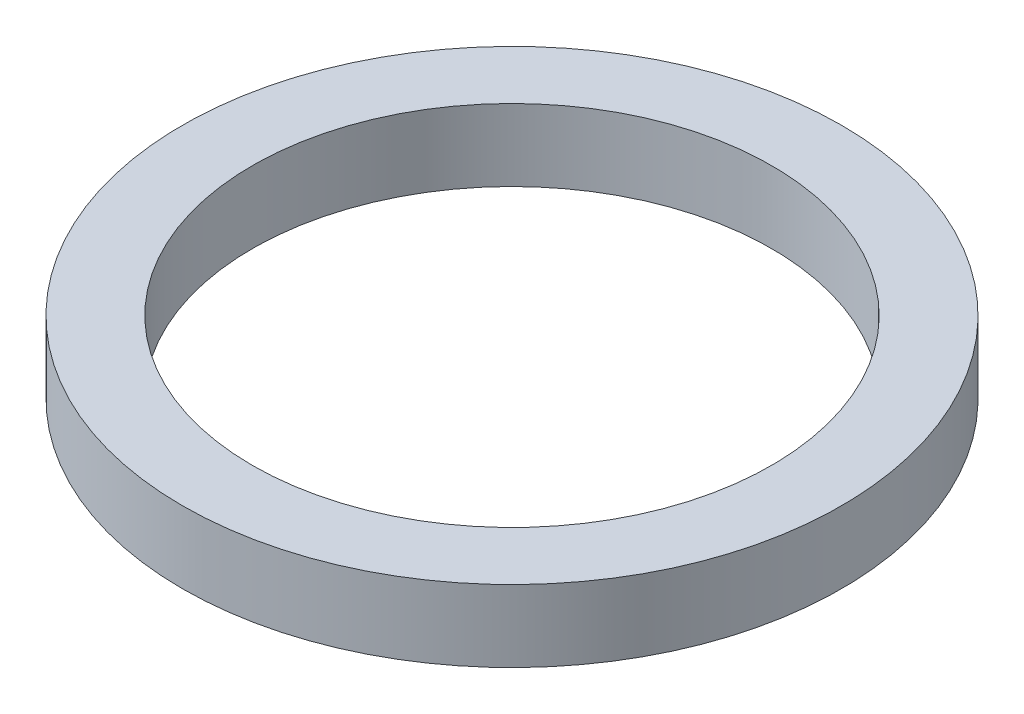
ISO-10303-21;
HEADER;
FILE_DESCRIPTION(('STEP AP214'),'2;1');
FILE_NAME('part.step','',(''),(''),'','','');
FILE_SCHEMA(('AUTOMOTIVE_DESIGN { 1 0 10303 214 1 1 1 1 }'));
ENDSEC;
DATA;
#1=APPLICATION_CONTEXT('core data for automotive mechanical design processes');
#2=APPLICATION_PROTOCOL_DEFINITION('international standard','automotive_design',2000,#1);
#3=PRODUCT_CONTEXT('',#1,'mechanical');
#4=PRODUCT('Part','Part','',(#3));
#5=PRODUCT_RELATED_PRODUCT_CATEGORY('part','',(#4));
#6=PRODUCT_DEFINITION_FORMATION('','',#4);
#7=PRODUCT_DEFINITION_CONTEXT('part definition',#1,'design');
#8=PRODUCT_DEFINITION('design','',#6,#7);
#9=PRODUCT_DEFINITION_SHAPE('','',#8);
#10=(LENGTH_UNIT() NAMED_UNIT(*) SI_UNIT(.MILLI.,.METRE.));
#11=(NAMED_UNIT(*) PLANE_ANGLE_UNIT() SI_UNIT($,.RADIAN.));
#12=(NAMED_UNIT(*) SI_UNIT($,.STERADIAN.) SOLID_ANGLE_UNIT());
#13=UNCERTAINTY_MEASURE_WITH_UNIT(LENGTH_MEASURE(1.E-05),#10,'distance_accuracy_value','');
#14=(GEOMETRIC_REPRESENTATION_CONTEXT(3) GLOBAL_UNCERTAINTY_ASSIGNED_CONTEXT((#13)) GLOBAL_UNIT_ASSIGNED_CONTEXT((#10,
#11,#12)) REPRESENTATION_CONTEXT('',''));
#15=CARTESIAN_POINT('',(0.,0.,0.));
#16=DIRECTION('',(0.,0.,1.));
#17=DIRECTION('',(1.,0.,0.));
#18=AXIS2_PLACEMENT_3D('',#15,#16,#17);
#19=CARTESIAN_POINT('',(0.,18.,0.));
#20=DIRECTION('',(0.,1.,0.));
#21=DIRECTION('',(0.,0.,1.));
#22=AXIS2_PLACEMENT_3D('',#19,#20,#21);
#23=PLANE('',#22);
#24=CARTESIAN_POINT('',(0.,18.,0.));
#25=DIRECTION('',(0.,1.,0.));
#26=DIRECTION('',(0.,0.,1.));
#27=AXIS2_PLACEMENT_3D('',#24,#25,#26);
#28=CIRCLE('',#27,82.5);
#29=CARTESIAN_POINT('',(0.,18.,82.5));
#30=VERTEX_POINT('',#29);
#31=EDGE_CURVE('E10',#30,#30,#28,.T.);
#32=ORIENTED_EDGE('',*,*,#31,.T.);
#33=EDGE_LOOP('',(#32));
#34=FACE_BOUND('',#33,.T.);
#35=CARTESIAN_POINT('',(0.,18.,0.));
#36=DIRECTION('',(0.,1.,0.));
#37=DIRECTION('',(0.,0.,1.));
#38=AXIS2_PLACEMENT_3D('',#35,#36,#37);
#39=CIRCLE('',#38,65.);
#40=CARTESIAN_POINT('',(0.,18.,65.));
#41=VERTEX_POINT('',#40);
#42=EDGE_CURVE('E41',#41,#41,#39,.T.);
#43=ORIENTED_EDGE('',*,*,#42,.F.);
#44=EDGE_LOOP('',(#43));
#45=FACE_BOUND('',#44,.T.);
#46=ADVANCED_FACE('F30',(#34,#45),#23,.T.);
#47=CARTESIAN_POINT('',(0.,0.,0.));
#48=DIRECTION('',(0.,1.,0.));
#49=DIRECTION('',(0.,0.,1.));
#50=AXIS2_PLACEMENT_3D('',#47,#48,#49);
#51=PLANE('',#50);
#52=CARTESIAN_POINT('',(0.,0.,0.));
#53=DIRECTION('',(0.,1.,0.));
#54=DIRECTION('',(0.,0.,1.));
#55=AXIS2_PLACEMENT_3D('',#52,#53,#54);
#56=CIRCLE('',#55,82.5);
#57=CARTESIAN_POINT('',(0.,0.,82.5));
#58=VERTEX_POINT('',#57);
#59=EDGE_CURVE('E34',#58,#58,#56,.T.);
#60=ORIENTED_EDGE('',*,*,#59,.F.);
#61=EDGE_LOOP('',(#60));
#62=FACE_BOUND('',#61,.T.);
#63=CARTESIAN_POINT('',(0.,0.,0.));
#64=DIRECTION('',(0.,1.,0.));
#65=DIRECTION('',(0.,0.,1.));
#66=AXIS2_PLACEMENT_3D('',#63,#64,#65);
#67=CIRCLE('',#66,65.);
#68=CARTESIAN_POINT('',(0.,0.,65.));
#69=VERTEX_POINT('',#68);
#70=EDGE_CURVE('E43',#69,#69,#67,.T.);
#71=ORIENTED_EDGE('',*,*,#70,.T.);
#72=EDGE_LOOP('',(#71));
#73=FACE_BOUND('',#72,.T.);
#74=ADVANCED_FACE('F53',(#62,#73),#51,.F.);
#75=CARTESIAN_POINT('',(0.,18.,0.));
#76=DIRECTION('',(0.,-1.,0.));
#77=DIRECTION('',(0.,0.,-1.));
#78=AXIS2_PLACEMENT_3D('',#75,#76,#77);
#79=CYLINDRICAL_SURFACE('',#78,82.5);
#80=ORIENTED_EDGE('',*,*,#31,.F.);
#81=EDGE_LOOP('',(#80));
#82=FACE_BOUND('',#81,.T.);
#83=ORIENTED_EDGE('',*,*,#59,.T.);
#84=EDGE_LOOP('',(#83));
#85=FACE_BOUND('',#84,.T.);
#86=ADVANCED_FACE('F32',(#82,#85),#79,.T.);
#87=CARTESIAN_POINT('',(0.,18.,0.));
#88=DIRECTION('',(0.,-1.,0.));
#89=DIRECTION('',(0.,0.,-1.));
#90=AXIS2_PLACEMENT_3D('',#87,#88,#89);
#91=CYLINDRICAL_SURFACE('',#90,65.);
#92=ORIENTED_EDGE('',*,*,#42,.T.);
#93=EDGE_LOOP('',(#92));
#94=FACE_BOUND('',#93,.T.);
#95=ORIENTED_EDGE('',*,*,#70,.F.);
#96=EDGE_LOOP('',(#95));
#97=FACE_BOUND('',#96,.T.);
#98=ADVANCED_FACE('F49',(#94,#97),#91,.F.);
#99=CLOSED_SHELL('',(#46,#74,#86,#98));
#100=MANIFOLD_SOLID_BREP('B2',#99);
#101=ADVANCED_BREP_SHAPE_REPRESENTATION('',(#18,#100),#14);
#102=SHAPE_DEFINITION_REPRESENTATION(#9,#101);
ENDSEC;
END-ISO-10303-21;
